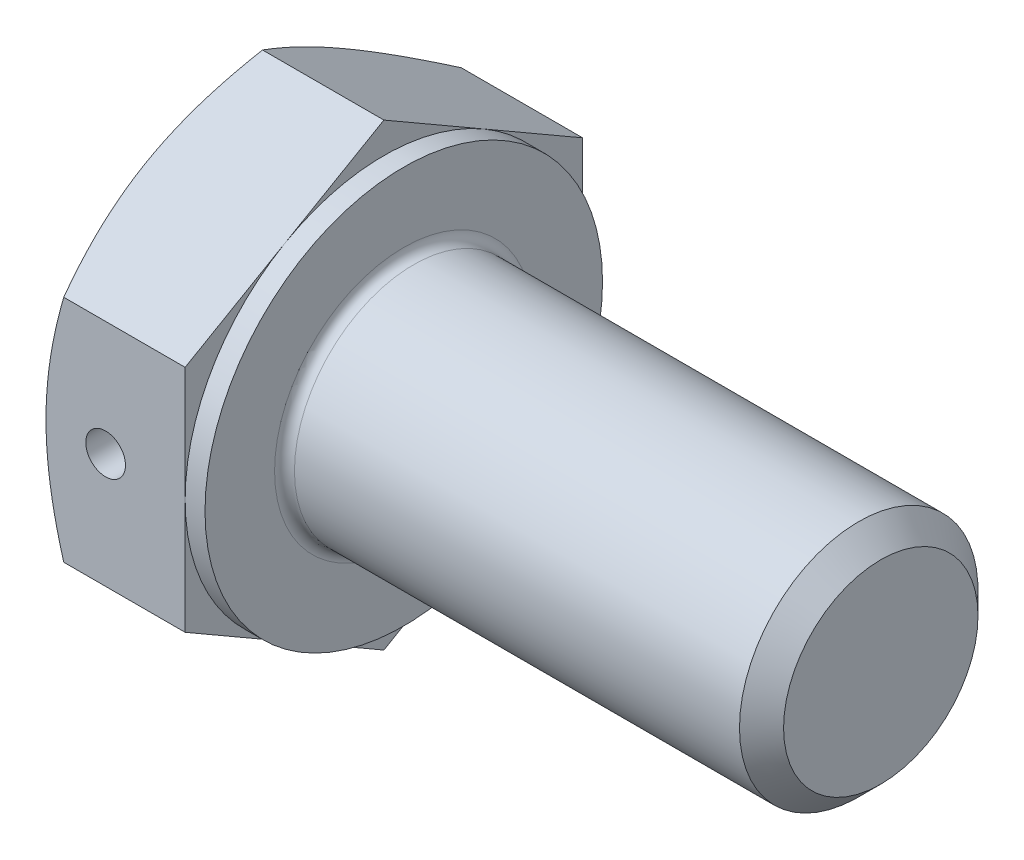
ISO-10303-21;
HEADER;
FILE_DESCRIPTION(('STEP AP214'),'2;1');
FILE_NAME('part.step','',(''),(''),'','','');
FILE_SCHEMA(('AUTOMOTIVE_DESIGN { 1 0 10303 214 1 1 1 1 }'));
ENDSEC;
DATA;
#1=APPLICATION_CONTEXT('core data for automotive mechanical design processes');
#2=APPLICATION_PROTOCOL_DEFINITION('international standard','automotive_design',2000,#1);
#3=PRODUCT_CONTEXT('',#1,'mechanical');
#4=PRODUCT('Part','Part','',(#3));
#5=PRODUCT_RELATED_PRODUCT_CATEGORY('part','',(#4));
#6=PRODUCT_DEFINITION_FORMATION('','',#4);
#7=PRODUCT_DEFINITION_CONTEXT('part definition',#1,'design');
#8=PRODUCT_DEFINITION('design','',#6,#7);
#9=PRODUCT_DEFINITION_SHAPE('','',#8);
#10=(LENGTH_UNIT() NAMED_UNIT(*) SI_UNIT(.MILLI.,.METRE.));
#11=(NAMED_UNIT(*) PLANE_ANGLE_UNIT() SI_UNIT($,.RADIAN.));
#12=(NAMED_UNIT(*) SI_UNIT($,.STERADIAN.) SOLID_ANGLE_UNIT());
#13=UNCERTAINTY_MEASURE_WITH_UNIT(LENGTH_MEASURE(1.E-05),#10,'distance_accuracy_value','');
#14=(GEOMETRIC_REPRESENTATION_CONTEXT(3) GLOBAL_UNCERTAINTY_ASSIGNED_CONTEXT((#13)) GLOBAL_UNIT_ASSIGNED_CONTEXT((#10,
#11,#12)) REPRESENTATION_CONTEXT('',''));
#15=CARTESIAN_POINT('',(0.,0.,0.));
#16=DIRECTION('',(0.,0.,1.));
#17=DIRECTION('',(1.,0.,0.));
#18=AXIS2_PLACEMENT_3D('',#15,#16,#17);
#19=CARTESIAN_POINT('',(4.,5.77350269189626,0.));
#20=DIRECTION('',(1.,0.,0.));
#21=DIRECTION('',(0.,0.,-1.));
#22=AXIS2_PLACEMENT_3D('',#19,#20,#21);
#23=PLANE('',#22);
#24=CARTESIAN_POINT('',(4.,0.,0.));
#25=DIRECTION('',(1.,0.,0.));
#26=DIRECTION('',(0.,0.,-1.));
#27=AXIS2_PLACEMENT_3D('',#24,#25,#26);
#28=CIRCLE('',#27,3.25);
#29=CARTESIAN_POINT('',(4.,0.,-3.25));
#30=VERTEX_POINT('',#29);
#31=EDGE_CURVE('E43',#30,#30,#28,.F.);
#32=ORIENTED_EDGE('',*,*,#31,.T.);
#33=EDGE_LOOP('',(#32));
#34=FACE_BOUND('',#33,.T.);
#35=CARTESIAN_POINT('',(4.,0.,0.));
#36=DIRECTION('',(1.,0.,0.));
#37=DIRECTION('',(0.,0.,-1.));
#38=AXIS2_PLACEMENT_3D('',#35,#36,#37);
#39=CIRCLE('',#38,5.);
#40=CARTESIAN_POINT('',(4.,0.,-5.));
#41=VERTEX_POINT('',#40);
#42=EDGE_CURVE('E302',#41,#41,#39,.T.);
#43=ORIENTED_EDGE('',*,*,#42,.T.);
#44=EDGE_LOOP('',(#43));
#45=FACE_BOUND('',#44,.T.);
#46=ADVANCED_FACE('F35',(#34,#45),#23,.T.);
#47=CARTESIAN_POINT('',(0.,0.,0.));
#48=DIRECTION('',(-1.,0.,0.));
#49=DIRECTION('',(0.,0.,1.));
#50=AXIS2_PLACEMENT_3D('',#47,#48,#49);
#51=CYLINDRICAL_SURFACE('',#50,3.);
#52=CARTESIAN_POINT('',(4.25,0.,0.));
#53=DIRECTION('',(1.,0.,0.));
#54=DIRECTION('',(0.,0.,-1.));
#55=AXIS2_PLACEMENT_3D('',#52,#53,#54);
#56=CIRCLE('',#55,3.);
#57=CARTESIAN_POINT('',(4.25,0.,-3.));
#58=VERTEX_POINT('',#57);
#59=EDGE_CURVE('E11',#58,#58,#56,.T.);
#60=ORIENTED_EDGE('',*,*,#59,.T.);
#61=EDGE_LOOP('',(#60));
#62=FACE_BOUND('',#61,.T.);
#63=CARTESIAN_POINT('',(15.4455,0.,0.));
#64=DIRECTION('',(-1.,0.,0.));
#65=DIRECTION('',(0.,0.,1.));
#66=AXIS2_PLACEMENT_3D('',#63,#64,#65);
#67=CIRCLE('',#66,3.);
#68=CARTESIAN_POINT('',(15.4455,0.,3.));
#69=VERTEX_POINT('',#68);
#70=EDGE_CURVE('E281',#69,#69,#67,.T.);
#71=ORIENTED_EDGE('',*,*,#70,.T.);
#72=EDGE_LOOP('',(#71));
#73=FACE_BOUND('',#72,.T.);
#74=ADVANCED_FACE('F255',(#62,#73),#51,.T.);
#75=CARTESIAN_POINT('',(16.,0.,0.));
#76=DIRECTION('',(-1.,0.,0.));
#77=DIRECTION('',(0.,0.,1.));
#78=AXIS2_PLACEMENT_3D('',#75,#76,#77);
#79=CONICAL_SURFACE('',#78,2.4455,0.785398163397438);
#80=ORIENTED_EDGE('',*,*,#70,.F.);
#81=EDGE_LOOP('',(#80));
#82=FACE_BOUND('',#81,.T.);
#83=CARTESIAN_POINT('',(16.,0.,0.));
#84=DIRECTION('',(-1.,0.,0.));
#85=DIRECTION('',(0.,0.,1.));
#86=AXIS2_PLACEMENT_3D('',#83,#84,#85);
#87=CIRCLE('',#86,2.4455);
#88=CARTESIAN_POINT('',(16.,0.,2.4455));
#89=VERTEX_POINT('',#88);
#90=EDGE_CURVE('E279',#89,#89,#87,.T.);
#91=ORIENTED_EDGE('',*,*,#90,.T.);
#92=EDGE_LOOP('',(#91));
#93=FACE_BOUND('',#92,.T.);
#94=ADVANCED_FACE('F260',(#82,#93),#79,.T.);
#95=CARTESIAN_POINT('',(16.,0.,0.));
#96=DIRECTION('',(-1.,0.,0.));
#97=DIRECTION('',(0.,0.,1.));
#98=AXIS2_PLACEMENT_3D('',#95,#96,#97);
#99=PLANE('',#98);
#100=ORIENTED_EDGE('',*,*,#90,.F.);
#101=EDGE_LOOP('',(#100));
#102=FACE_BOUND('',#101,.T.);
#103=ADVANCED_FACE('F267',(#102),#99,.F.);
#104=CARTESIAN_POINT('',(3.5,5.,0.));
#105=DIRECTION('',(1.,0.,0.));
#106=DIRECTION('',(0.,0.,-1.));
#107=AXIS2_PLACEMENT_3D('',#104,#105,#106);
#108=PLANE('',#107);
#109=DIRECTION('',(0.,0.500000000000001,0.866025403784438));
#110=VECTOR('',#109,1.);
#111=CARTESIAN_POINT('',(3.5,2.88675134594812,-5.));
#112=LINE('',#111,#110);
#113=CARTESIAN_POINT('',(3.5,2.88675134594812,-5.));
#114=VERTEX_POINT('',#113);
#115=CARTESIAN_POINT('',(3.5,4.33012701892219,-2.50000000000001));
#116=VERTEX_POINT('',#115);
#117=EDGE_CURVE('E168',#114,#116,#112,.T.);
#118=ORIENTED_EDGE('',*,*,#117,.T.);
#119=CARTESIAN_POINT('',(3.5,0.,0.));
#120=DIRECTION('',(-1.,0.,0.));
#121=DIRECTION('',(0.,0.,1.));
#122=AXIS2_PLACEMENT_3D('',#119,#120,#121);
#123=CIRCLE('',#122,5.);
#124=CARTESIAN_POINT('',(3.5,0.,-5.));
#125=VERTEX_POINT('',#124);
#126=EDGE_CURVE('E50',#116,#125,#123,.T.);
#127=ORIENTED_EDGE('',*,*,#126,.T.);
#128=DIRECTION('',(0.,1.,0.));
#129=VECTOR('',#128,1.);
#130=CARTESIAN_POINT('',(3.5,2.88675134594812,-5.));
#131=LINE('',#130,#129);
#132=EDGE_CURVE('E305',#125,#114,#131,.T.);
#133=ORIENTED_EDGE('',*,*,#132,.T.);
#134=EDGE_LOOP('',(#118,#127,#133));
#135=FACE_BOUND('',#134,.T.);
#136=ADVANCED_FACE('F270',(#135),#108,.T.);
#137=CARTESIAN_POINT('',(3.5,5.77350269189626,0.));
#138=VERTEX_POINT('',#137);
#139=EDGE_CURVE('E166',#116,#138,#112,.T.);
#140=ORIENTED_EDGE('',*,*,#139,.T.);
#141=DIRECTION('',(0.,-0.500000000000001,0.866025403784438));
#142=VECTOR('',#141,1.);
#143=CARTESIAN_POINT('',(3.5,5.77350269189626,0.));
#144=LINE('',#143,#142);
#145=CARTESIAN_POINT('',(3.5,4.33012701892219,2.5));
#146=VERTEX_POINT('',#145);
#147=EDGE_CURVE('E165',#138,#146,#144,.T.);
#148=ORIENTED_EDGE('',*,*,#147,.T.);
#149=EDGE_CURVE('E154',#146,#116,#123,.T.);
#150=ORIENTED_EDGE('',*,*,#149,.T.);
#151=EDGE_LOOP('',(#140,#148,#150));
#152=FACE_BOUND('',#151,.T.);
#153=ADVANCED_FACE('F275',(#152),#108,.T.);
#154=CARTESIAN_POINT('',(3.5,2.88675134594813,5.));
#155=VERTEX_POINT('',#154);
#156=EDGE_CURVE('E132',#146,#155,#144,.T.);
#157=ORIENTED_EDGE('',*,*,#156,.T.);
#158=DIRECTION('',(0.,-1.,0.));
#159=VECTOR('',#158,1.);
#160=CARTESIAN_POINT('',(3.5,2.88675134594813,5.));
#161=LINE('',#160,#159);
#162=CARTESIAN_POINT('',(3.5,0.,5.));
#163=VERTEX_POINT('',#162);
#164=EDGE_CURVE('E126',#155,#163,#161,.T.);
#165=ORIENTED_EDGE('',*,*,#164,.T.);
#166=EDGE_CURVE('E130',#163,#146,#123,.T.);
#167=ORIENTED_EDGE('',*,*,#166,.T.);
#168=EDGE_LOOP('',(#157,#165,#167));
#169=FACE_BOUND('',#168,.T.);
#170=ADVANCED_FACE('F128',(#169),#108,.T.);
#171=CARTESIAN_POINT('',(3.5,-2.88675134594812,5.));
#172=VERTEX_POINT('',#171);
#173=EDGE_CURVE('E136',#163,#172,#161,.T.);
#174=ORIENTED_EDGE('',*,*,#173,.T.);
#175=DIRECTION('',(0.,-0.500000000000002,-0.866025403784437));
#176=VECTOR('',#175,1.);
#177=CARTESIAN_POINT('',(3.5,-5.77350269189626,0.));
#178=LINE('',#177,#176);
#179=CARTESIAN_POINT('',(3.5,-4.33012701892219,2.50000000000001));
#180=VERTEX_POINT('',#179);
#181=EDGE_CURVE('E143',#172,#180,#178,.T.);
#182=ORIENTED_EDGE('',*,*,#181,.T.);
#183=EDGE_CURVE('E140',#180,#163,#123,.T.);
#184=ORIENTED_EDGE('',*,*,#183,.T.);
#185=EDGE_LOOP('',(#174,#182,#184));
#186=FACE_BOUND('',#185,.T.);
#187=ADVANCED_FACE('F141',(#186),#108,.T.);
#188=CARTESIAN_POINT('',(3.5,-5.77350269189626,0.));
#189=VERTEX_POINT('',#188);
#190=EDGE_CURVE('E160',#180,#189,#178,.T.);
#191=ORIENTED_EDGE('',*,*,#190,.T.);
#192=DIRECTION('',(0.,0.5,-0.866025403784439));
#193=VECTOR('',#192,1.);
#194=CARTESIAN_POINT('',(3.5,-2.88675134594814,-5.));
#195=LINE('',#194,#193);
#196=CARTESIAN_POINT('',(3.5,-4.33012701892219,-2.5));
#197=VERTEX_POINT('',#196);
#198=EDGE_CURVE('E344',#189,#197,#195,.T.);
#199=ORIENTED_EDGE('',*,*,#198,.T.);
#200=EDGE_CURVE('E147',#197,#180,#123,.T.);
#201=ORIENTED_EDGE('',*,*,#200,.T.);
#202=EDGE_LOOP('',(#191,#199,#201));
#203=FACE_BOUND('',#202,.T.);
#204=ADVANCED_FACE('F424',(#203),#108,.T.);
#205=CARTESIAN_POINT('',(3.5,-2.88675134594814,-5.));
#206=VERTEX_POINT('',#205);
#207=EDGE_CURVE('E155',#197,#206,#195,.T.);
#208=ORIENTED_EDGE('',*,*,#207,.T.);
#209=EDGE_CURVE('E306',#206,#125,#131,.T.);
#210=ORIENTED_EDGE('',*,*,#209,.T.);
#211=EDGE_CURVE('E313',#125,#197,#123,.T.);
#212=ORIENTED_EDGE('',*,*,#211,.T.);
#213=EDGE_LOOP('',(#208,#210,#212));
#214=FACE_BOUND('',#213,.T.);
#215=ADVANCED_FACE('F276',(#214),#108,.T.);
#216=CARTESIAN_POINT('',(0.,0.,0.));
#217=DIRECTION('',(-1.,0.,0.));
#218=DIRECTION('',(0.,0.,1.));
#219=AXIS2_PLACEMENT_3D('',#216,#217,#218);
#220=CYLINDRICAL_SURFACE('',#219,5.);
#221=ORIENTED_EDGE('',*,*,#126,.F.);
#222=ORIENTED_EDGE('',*,*,#149,.F.);
#223=ORIENTED_EDGE('',*,*,#166,.F.);
#224=ORIENTED_EDGE('',*,*,#183,.F.);
#225=ORIENTED_EDGE('',*,*,#200,.F.);
#226=ORIENTED_EDGE('',*,*,#211,.F.);
#227=EDGE_LOOP('',(#221,#222,#223,#224,#225,#226));
#228=FACE_BOUND('',#227,.T.);
#229=ORIENTED_EDGE('',*,*,#42,.F.);
#230=EDGE_LOOP('',(#229));
#231=FACE_BOUND('',#230,.T.);
#232=ADVANCED_FACE('F151',(#228,#231),#220,.T.);
#233=CARTESIAN_POINT('',(0.,5.77350269189626,0.));
#234=DIRECTION('',(1.,0.,0.));
#235=DIRECTION('',(0.,0.,-1.));
#236=AXIS2_PLACEMENT_3D('',#233,#234,#235);
#237=PLANE('',#236);
#238=CARTESIAN_POINT('',(0.,0.,0.));
#239=DIRECTION('',(1.,0.,0.));
#240=DIRECTION('',(0.,0.,-1.));
#241=AXIS2_PLACEMENT_3D('',#238,#239,#240);
#242=CIRCLE('',#241,5.);
#243=CARTESIAN_POINT('',(0.,0.,-5.));
#244=VERTEX_POINT('',#243);
#245=CARTESIAN_POINT('',(0.,4.33012701892219,-2.50000000000001));
#246=VERTEX_POINT('',#245);
#247=EDGE_CURVE('E301',#244,#246,#242,.T.);
#248=ORIENTED_EDGE('',*,*,#247,.F.);
#249=CARTESIAN_POINT('',(0.,-4.33012701892219,-2.5));
#250=VERTEX_POINT('',#249);
#251=EDGE_CURVE('E297',#250,#244,#242,.T.);
#252=ORIENTED_EDGE('',*,*,#251,.F.);
#253=CARTESIAN_POINT('',(0.,-4.33012701892219,2.50000000000001));
#254=VERTEX_POINT('',#253);
#255=EDGE_CURVE('E300',#254,#250,#242,.T.);
#256=ORIENTED_EDGE('',*,*,#255,.F.);
#257=CARTESIAN_POINT('',(0.,0.,5.));
#258=VERTEX_POINT('',#257);
#259=EDGE_CURVE('E337',#258,#254,#242,.T.);
#260=ORIENTED_EDGE('',*,*,#259,.F.);
#261=CARTESIAN_POINT('',(0.,0.,0.));
#262=DIRECTION('',(-1.,0.,0.));
#263=DIRECTION('',(0.,0.,1.));
#264=AXIS2_PLACEMENT_3D('',#261,#262,#263);
#265=CIRCLE('',#264,5.);
#266=CARTESIAN_POINT('',(0.,4.33012701892219,2.5));
#267=VERTEX_POINT('',#266);
#268=EDGE_CURVE('E169',#258,#267,#265,.T.);
#269=ORIENTED_EDGE('',*,*,#268,.T.);
#270=EDGE_CURVE('E537',#246,#267,#242,.T.);
#271=ORIENTED_EDGE('',*,*,#270,.F.);
#272=EDGE_LOOP('',(#248,#252,#256,#260,#269,#271));
#273=FACE_BOUND('',#272,.T.);
#274=ADVANCED_FACE('F200',(#273),#237,.F.);
#275=CARTESIAN_POINT('',(0.,0.,0.));
#276=DIRECTION('',(1.,0.,0.));
#277=DIRECTION('',(0.,0.,-1.));
#278=AXIS2_PLACEMENT_3D('',#275,#276,#277);
#279=CONICAL_SURFACE('',#278,5.,1.0471975511966);
#280=CARTESIAN_POINT('',(0.446648656051828,2.88663587589429,5.0002));
#281=CARTESIAN_POINT('',(0.373386567637634,3.01349970319368,4.78046540547481));
#282=CARTESIAN_POINT('',(0.306751321918091,3.14144859993849,4.55885141554042));
#283=CARTESIAN_POINT('',(0.190438991010811,3.39956193532121,4.11178600454649));
#284=CARTESIAN_POINT('',(0.140803049915789,3.52973095989718,3.88632664040923));
#285=CARTESIAN_POINT('',(0.0635510254186983,3.78847564779797,3.43816769477649));
#286=CARTESIAN_POINT('',(0.0354203782834895,3.91701101576052,3.21553790689581));
#287=CARTESIAN_POINT('',(0.0101949219536847,4.11026620624322,2.88081009815336));
#288=CARTESIAN_POINT('',(0.0046134597694843,4.17472868879311,2.76915780319494));
#289=CARTESIAN_POINT('',(-0.000797783248529215,4.30371322717528,2.5457500293262));
#290=CARTESIAN_POINT('',(-0.000627741741795892,4.36823528110589,2.43399455370969));
#291=CARTESIAN_POINT('',(0.00775363179203763,4.54500768479194,2.12781576914936));
#292=CARTESIAN_POINT('',(0.0218297718972528,4.65719946015293,1.93349391403279));
#293=CARTESIAN_POINT('',(0.0664652571094323,4.88083840557981,1.54613989800229));
#294=CARTESIAN_POINT('',(0.0970398601475096,4.9922847895602,1.35310909862843));
#295=CARTESIAN_POINT('',(0.173468493621165,5.21637431361295,0.964974657525145));
#296=CARTESIAN_POINT('',(0.219646378878682,5.32898917185759,0.769920001358264));
#297=CARTESIAN_POINT('',(0.324451794491936,5.55253939626498,0.382719654641232));
#298=CARTESIAN_POINT('',(0.383054703437376,5.66347762579592,0.190569004591914));
#299=CARTESIAN_POINT('',(0.446648656051831,5.7736181619501,-0.000200000000000145));
#300=B_SPLINE_CURVE_WITH_KNOTS('',3,(#280,#281,#282,#283,#284,#285,#286,#287,#288,#289,#290,
#291,#292,#293,#294,#295,#296,#297,#298,#299),.UNSPECIFIED.,.F.,.F.,(4,2,2,2,2,2,2,2,2,4),(0.,
0.792555841363092,1.58701660053333,2.3618153748728,2.74884076077325,3.13585419177295,
3.80962362599679,4.48401723901189,5.17336882348929,5.86136694793726),.UNSPECIFIED.);
#301=CARTESIAN_POINT('',(0.446581987385204,5.77350269189626,0.));
#302=VERTEX_POINT('',#301);
#303=EDGE_CURVE('E220',#267,#302,#300,.T.);
#304=ORIENTED_EDGE('',*,*,#303,.T.);
#305=CARTESIAN_POINT('',(0.446648656051831,5.7736181619501,0.0002));
#306=CARTESIAN_POINT('',(0.373386567637636,5.64675433465071,-0.219534594525184));
#307=CARTESIAN_POINT('',(0.306751321918093,5.5188054379059,-0.44114858445958));
#308=CARTESIAN_POINT('',(0.190438991010812,5.26069210252318,-0.888213995453513));
#309=CARTESIAN_POINT('',(0.14080304991579,5.13052307794721,-1.11367335959077));
#310=CARTESIAN_POINT('',(0.0635510254186986,4.87177839004641,-1.56183230522351));
#311=CARTESIAN_POINT('',(0.0354203782834896,4.74324302208387,-1.78446209310419));
#312=CARTESIAN_POINT('',(0.0101949219536845,4.54998783160116,-2.11918990184664));
#313=CARTESIAN_POINT('',(0.004613459769484,4.48552534905128,-2.23084219680506));
#314=CARTESIAN_POINT('',(-0.000797783248529931,4.35654081066911,-2.4542499706738));
#315=CARTESIAN_POINT('',(-0.000627741741796942,4.2920187567385,-2.56600544629031));
#316=CARTESIAN_POINT('',(0.00775363179203599,4.11524635305244,-2.87218423085064));
#317=CARTESIAN_POINT('',(0.0218297718972511,4.00305457769146,-3.06650608596721));
#318=CARTESIAN_POINT('',(0.0664652571094302,3.77941563226457,-3.4538601019977));
#319=CARTESIAN_POINT('',(0.0970398601475071,3.66796924828418,-3.64689090137157));
#320=CARTESIAN_POINT('',(0.173468493621162,3.44387972423144,-4.03502534247485));
#321=CARTESIAN_POINT('',(0.219646378878678,3.3312648659868,-4.23007999864173));
#322=CARTESIAN_POINT('',(0.324451794491932,3.1077146415794,-4.61728034535877));
#323=CARTESIAN_POINT('',(0.383054703437373,2.99677641204846,-4.80943099540808));
#324=CARTESIAN_POINT('',(0.446648656051827,2.88663587589428,-5.0002));
#325=B_SPLINE_CURVE_WITH_KNOTS('',3,(#305,#306,#307,#308,#309,#310,#311,#312,#313,#314,#315,
#316,#317,#318,#319,#320,#321,#322,#323,#324),.UNSPECIFIED.,.F.,.F.,(4,2,2,2,2,2,2,2,2,4),(0.,
0.792555841363091,1.58701660053333,2.36181537487281,2.74884076077325,3.13585419177295,
3.80962362599679,4.48401723901189,5.17336882348929,5.86136694793726),.UNSPECIFIED.);
#326=EDGE_CURVE('E58',#302,#246,#325,.T.);
#327=ORIENTED_EDGE('',*,*,#326,.T.);
#328=ORIENTED_EDGE('',*,*,#270,.T.);
#329=EDGE_LOOP('',(#304,#327,#328));
#330=FACE_BOUND('',#329,.T.);
#331=ADVANCED_FACE('F464',(#330),#279,.T.);
#332=CARTESIAN_POINT('',(2.47533544689295,-7.82661640313889,5.));
#333=CARTESIAN_POINT('',(2.36879683507773,-7.60758613024921,5.));
#334=CARTESIAN_POINT('',(2.26325911833056,-7.3880607136441,5.));
#335=CARTESIAN_POINT('',(2.0547470786595,-6.94775649535433,5.));
#336=CARTESIAN_POINT('',(1.95177314617002,-6.72697750897688,5.));
#337=CARTESIAN_POINT('',(1.74844778545275,-6.28280027125597,5.));
#338=CARTESIAN_POINT('',(1.64811306490869,-6.05939434592713,5.));
#339=CARTESIAN_POINT('',(1.45145486004312,-5.6108304383292,5.));
#340=CARTESIAN_POINT('',(1.35513119080617,-5.38567253739804,5.));
#341=CARTESIAN_POINT('',(1.1644503760596,-4.92576614780202,5.));
#342=CARTESIAN_POINT('',(1.07026351405995,-4.69094667859484,5.));
#343=CARTESIAN_POINT('',(0.888844387350836,-4.21858752735362,5.));
#344=CARTESIAN_POINT('',(0.801612892640658,-3.98104754746317,5.));
#345=CARTESIAN_POINT('',(0.636341071883238,-3.50329086404363,5.));
#346=CARTESIAN_POINT('',(0.558282765149709,-3.26308044250486,5.));
#347=CARTESIAN_POINT('',(0.413813856737664,-2.77921467819531,5.));
#348=CARTESIAN_POINT('',(0.347399663631974,-2.53556042275999,5.));
#349=CARTESIAN_POINT('',(0.22970745053505,-2.04600448312503,5.));
#350=CARTESIAN_POINT('',(0.178346573442478,-1.80012308686183,5.));
#351=CARTESIAN_POINT('',(0.0936230804935147,-1.30522837494365,5.));
#352=CARTESIAN_POINT('',(0.0602585789244923,-1.05621539022477,5.));
#353=CARTESIAN_POINT('',(0.0146229933804845,-0.559584253783065,5.));
#354=CARTESIAN_POINT('',(0.00207498506584089,-0.311992192967672,5.));
#355=CARTESIAN_POINT('',(-0.00159747165030503,0.18337558405674,5.));
#356=CARTESIAN_POINT('',(0.00727849448086304,0.431151303726643,5.));
#357=CARTESIAN_POINT('',(0.0397265053205849,0.84962286075823,5.));
#358=CARTESIAN_POINT('',(0.0579847912618801,1.02075746544157,5.));
#359=CARTESIAN_POINT('',(0.103624049996723,1.3618139875752,5.));
#360=CARTESIAN_POINT('',(0.131006199082925,1.53173574577271,5.));
#361=CARTESIAN_POINT('',(0.225403333816324,2.03942834541587,5.));
#362=CARTESIAN_POINT('',(0.304653621104038,2.37495177168563,5.));
#363=CARTESIAN_POINT('',(0.442611792168641,2.87686006020152,5.));
#364=CARTESIAN_POINT('',(0.492453035928118,3.04583048582565,5.));
#365=CARTESIAN_POINT('',(0.597441969480142,3.38213061038659,5.));
#366=CARTESIAN_POINT('',(0.652589698776808,3.5494602970987,5.));
#367=CARTESIAN_POINT('',(0.767295730006399,3.88253122341817,5.));
#368=CARTESIAN_POINT('',(0.826852713137817,4.04827292137365,5.));
#369=CARTESIAN_POINT('',(0.949663499110053,4.37837269604184,5.));
#370=CARTESIAN_POINT('',(1.01291722636637,4.54273080096526,5.));
#371=CARTESIAN_POINT('',(1.18384085306905,4.9746759403977,5.));
#372=CARTESIAN_POINT('',(1.29410564783453,5.24123504256649,5.));
#373=CARTESIAN_POINT('',(1.52085041203993,5.77170603526335,5.));
#374=CARTESIAN_POINT('',(1.63733099805397,6.03561766007929,5.));
#375=CARTESIAN_POINT('',(1.87507624393349,6.56138078778338,5.));
#376=CARTESIAN_POINT('',(1.99634255328238,6.82323154239329,5.));
#377=CARTESIAN_POINT('',(2.24254703861693,7.34518395602016,5.));
#378=CARTESIAN_POINT('',(2.36748508200602,7.60528567778375,5.));
#379=CARTESIAN_POINT('',(2.62044102887898,8.12446478659922,5.));
#380=CARTESIAN_POINT('',(2.74846325062126,8.38354006552433,5.));
#381=CARTESIAN_POINT('',(3.00682668967549,8.90053291127541,5.));
#382=CARTESIAN_POINT('',(3.13716793074432,9.15845046620729,5.));
#383=CARTESIAN_POINT('',(3.53092424591317,9.93067662274979,5.));
#384=CARTESIAN_POINT('',(3.79712405172275,10.4435647238032,5.));
#385=CARTESIAN_POINT('',(4.30724046881171,11.4147548711532,5.));
#386=CARTESIAN_POINT('',(4.55067498762245,11.873311348306,5.));
#387=CARTESIAN_POINT('',(5.04052915785298,12.7888590468283,5.));
#388=CARTESIAN_POINT('',(5.28694897482744,13.2458501795696,5.));
#389=CARTESIAN_POINT('',(5.7812250534644,14.1571829390174,5.));
#390=CARTESIAN_POINT('',(6.02907430461245,14.6115283739736,5.));
#391=CARTESIAN_POINT('',(6.5264818551985,15.5192398746589,5.));
#392=CARTESIAN_POINT('',(6.77604002809907,15.9726060096992,5.));
#393=CARTESIAN_POINT('',(7.02622264559118,16.4256251044156,5.));
#394=B_SPLINE_CURVE_WITH_KNOTS('',3,(#332,#333,#334,#335,#336,#337,#338,#339,#340,#341,#342,
#343,#344,#345,#346,#347,#348,#349,#350,#351,#352,#353,#354,#355,#356,#357,#358,#359,#360,#361,
#362,#363,#364,#365,#366,#367,#368,#369,#370,#371,#372,#373,#374,#375,#376,#377,#378,#379,#380,
#381,#382,#383,#384,#385,#386,#387,#388,#389,#390,#391,#392,#393),.UNSPECIFIED.,.F.,.F.,(4,2,2,
2,2,2,2,2,2,2,2,2,2,2,2,2,2,2,2,2,2,2,2,2,2,2,2,2,2,2,4),(0.,0.730708682143098,1.4615279703375,
2.19620403652928,2.930846195478,3.68977491658213,4.44878753915767,5.20628666210828,
5.9635517348485,6.71656679485872,7.46950293642267,8.21233991237299,8.95519126159773,
9.47125991232469,9.98739512288342,11.0201893937443,11.5486465414698,12.0771076235976,
12.6054112774226,13.1337041332035,13.9989833719716,14.8643486020619,15.7300147459346,
16.5956496665091,17.4625765068272,18.3295122333794,20.0630293163822,21.6205191219182,
23.1780956996636,24.7307447704824,26.2832800921359),.UNSPECIFIED.);
#395=CARTESIAN_POINT('',(0.446581987385202,2.88675134594813,5.));
#396=VERTEX_POINT('',#395);
#397=EDGE_CURVE('E234',#258,#396,#394,.T.);
#398=ORIENTED_EDGE('',*,*,#397,.T.);
#399=EDGE_CURVE('E233',#396,#267,#300,.T.);
#400=ORIENTED_EDGE('',*,*,#399,.T.);
#401=ORIENTED_EDGE('',*,*,#268,.F.);
#402=EDGE_LOOP('',(#398,#400,#401));
#403=FACE_BOUND('',#402,.T.);
#404=ADVANCED_FACE('F331',(#403),#279,.T.);
#405=CARTESIAN_POINT('',(0.4465819873852,-2.88675134594812,5.));
#406=VERTEX_POINT('',#405);
#407=EDGE_CURVE('E282',#406,#258,#394,.T.);
#408=ORIENTED_EDGE('',*,*,#407,.T.);
#409=ORIENTED_EDGE('',*,*,#259,.T.);
#410=CARTESIAN_POINT('',(0.446648656051832,-5.7736181619501,-0.000200000000000053));
#411=CARTESIAN_POINT('',(0.373386567637638,-5.64675433465071,0.219534594525185));
#412=CARTESIAN_POINT('',(0.306751321918095,-5.5188054379059,0.441148584459581));
#413=CARTESIAN_POINT('',(0.190438991010813,-5.26069210252318,0.888213995453513));
#414=CARTESIAN_POINT('',(0.140803049915791,-5.13052307794721,1.11367335959077));
#415=CARTESIAN_POINT('',(0.0635510254186995,-4.87177839004641,1.56183230522351));
#416=CARTESIAN_POINT('',(0.0354203782834905,-4.74324302208387,1.78446209310419));
#417=CARTESIAN_POINT('',(0.0101949219536848,-4.54998783160116,2.11918990184664));
#418=CARTESIAN_POINT('',(0.00461345976948395,-4.48552534905128,2.23084219680506));
#419=CARTESIAN_POINT('',(-0.000797783248529864,-4.35654081066911,2.4542499706738));
#420=CARTESIAN_POINT('',(-0.000627741741796435,-4.2920187567385,2.56600544629031));
#421=CARTESIAN_POINT('',(0.00775363179203685,-4.11524635305244,2.87218423085064));
#422=CARTESIAN_POINT('',(0.0218297718972513,-4.00305457769146,3.06650608596721));
#423=CARTESIAN_POINT('',(0.0664652571094299,-3.77941563226457,3.4538601019977));
#424=CARTESIAN_POINT('',(0.097039860147507,-3.66796924828418,3.64689090137157));
#425=CARTESIAN_POINT('',(0.173468493621162,-3.44387972423143,4.03502534247485));
#426=CARTESIAN_POINT('',(0.219646378878678,-3.33126486598679,4.23007999864174));
#427=CARTESIAN_POINT('',(0.324451794491932,-3.1077146415794,4.61728034535877));
#428=CARTESIAN_POINT('',(0.383054703437372,-2.99677641204846,4.80943099540809));
#429=CARTESIAN_POINT('',(0.446648656051826,-2.88663587589428,5.0002));
#430=B_SPLINE_CURVE_WITH_KNOTS('',3,(#410,#411,#412,#413,#414,#415,#416,#417,#418,#419,#420,
#421,#422,#423,#424,#425,#426,#427,#428,#429),.UNSPECIFIED.,.F.,.F.,(4,2,2,2,2,2,2,2,2,4),(0.,
0.792555841363092,1.58701660053334,2.36181537487281,2.74884076077326,3.13585419177295,
3.8096236259968,4.4840172390119,5.17336882348929,5.86136694793726),.UNSPECIFIED.);
#431=EDGE_CURVE('E222',#254,#406,#430,.T.);
#432=ORIENTED_EDGE('',*,*,#431,.T.);
#433=EDGE_LOOP('',(#408,#409,#432));
#434=FACE_BOUND('',#433,.T.);
#435=ADVANCED_FACE('F189',(#434),#279,.T.);
#436=CARTESIAN_POINT('',(0.446581987385206,-5.77350269189626,0.));
#437=VERTEX_POINT('',#436);
#438=EDGE_CURVE('E214',#437,#254,#430,.T.);
#439=ORIENTED_EDGE('',*,*,#438,.T.);
#440=ORIENTED_EDGE('',*,*,#255,.T.);
#441=CARTESIAN_POINT('',(0.446648656051831,-2.8866358758943,-5.0002));
#442=CARTESIAN_POINT('',(0.373386567637637,-3.01349970319369,-4.78046540547481));
#443=CARTESIAN_POINT('',(0.306751321918094,-3.1414485999385,-4.55885141554042));
#444=CARTESIAN_POINT('',(0.190438991010813,-3.39956193532121,-4.11178600454649));
#445=CARTESIAN_POINT('',(0.140803049915792,-3.52973095989718,-3.88632664040922));
#446=CARTESIAN_POINT('',(0.0635510254187008,-3.78847564779798,-3.43816769477649));
#447=CARTESIAN_POINT('',(0.0354203782834923,-3.91701101576052,-3.2155379068958));
#448=CARTESIAN_POINT('',(0.010194921953688,-4.11026620624323,-2.88081009815336));
#449=CARTESIAN_POINT('',(0.00461345976948779,-4.17472868879311,-2.76915780319494));
#450=CARTESIAN_POINT('',(-0.000797783248525694,-4.30371322717528,-2.5457500293262));
#451=CARTESIAN_POINT('',(-0.000627741741792554,-4.3682352811059,-2.43399455370968));
#452=CARTESIAN_POINT('',(0.00775363179204073,-4.54500768479195,-2.12781576914936));
#453=CARTESIAN_POINT('',(0.021829771897256,-4.65719946015293,-1.93349391403278));
#454=CARTESIAN_POINT('',(0.0664652571094357,-4.88083840557982,-1.54613989800229));
#455=CARTESIAN_POINT('',(0.097039860147513,-4.99228478956021,-1.35310909862843));
#456=CARTESIAN_POINT('',(0.173468493621168,-5.21637431361296,-0.964974657525144));
#457=CARTESIAN_POINT('',(0.219646378878684,-5.32898917185759,-0.769920001358263));
#458=CARTESIAN_POINT('',(0.324451794491938,-5.55253939626499,-0.382719654641231));
#459=CARTESIAN_POINT('',(0.383054703437377,-5.66347762579592,-0.190569004591914));
#460=CARTESIAN_POINT('',(0.446648656051832,-5.7736181619501,0.000199999999999122));
#461=B_SPLINE_CURVE_WITH_KNOTS('',3,(#441,#442,#443,#444,#445,#446,#447,#448,#449,#450,#451,
#452,#453,#454,#455,#456,#457,#458,#459,#460),.UNSPECIFIED.,.F.,.F.,(4,2,2,2,2,2,2,2,2,4),(0.,
0.792555841363091,1.58701660053334,2.36181537487281,2.74884076077326,3.13585419177295,
3.80962362599679,4.48401723901189,5.17336882348929,5.86136694793725),.UNSPECIFIED.);
#462=EDGE_CURVE('E221',#250,#437,#461,.T.);
#463=ORIENTED_EDGE('',*,*,#462,.T.);
#464=EDGE_LOOP('',(#439,#440,#463));
#465=FACE_BOUND('',#464,.T.);
#466=ADVANCED_FACE('F476',(#465),#279,.T.);
#467=CARTESIAN_POINT('',(0.446581987385201,2.88675134594812,-5.));
#468=VERTEX_POINT('',#467);
#469=EDGE_CURVE('E223',#246,#468,#325,.T.);
#470=ORIENTED_EDGE('',*,*,#469,.T.);
#471=CARTESIAN_POINT('',(2.47533544689296,-7.82661640313891,-5.));
#472=CARTESIAN_POINT('',(2.36879683507774,-7.60758613024923,-5.));
#473=CARTESIAN_POINT('',(2.26325911833057,-7.38806071364412,-5.));
#474=CARTESIAN_POINT('',(2.05474707865951,-6.94775649535435,-5.));
#475=CARTESIAN_POINT('',(1.95177314617003,-6.7269775089769,-5.));
#476=CARTESIAN_POINT('',(1.74844778545275,-6.28280027125599,-5.));
#477=CARTESIAN_POINT('',(1.6481130649087,-6.05939434592714,-5.));
#478=CARTESIAN_POINT('',(1.45145486004313,-5.61083043832922,-5.));
#479=CARTESIAN_POINT('',(1.35513119080618,-5.38567253739806,-5.));
#480=CARTESIAN_POINT('',(1.16445037605961,-4.92576614780204,-5.));
#481=CARTESIAN_POINT('',(1.07026351405996,-4.69094667859486,-5.));
#482=CARTESIAN_POINT('',(0.888844387350842,-4.21858752735364,-5.));
#483=CARTESIAN_POINT('',(0.801612892640664,-3.98104754746318,-5.));
#484=CARTESIAN_POINT('',(0.636341071883244,-3.50329086404365,-5.));
#485=CARTESIAN_POINT('',(0.558282765149714,-3.26308044250488,-5.));
#486=CARTESIAN_POINT('',(0.413813856737668,-2.77921467819533,-5.));
#487=CARTESIAN_POINT('',(0.347399663631978,-2.53556042276,-5.));
#488=CARTESIAN_POINT('',(0.229707450535054,-2.04600448312504,-5.));
#489=CARTESIAN_POINT('',(0.178346573442481,-1.80012308686185,-5.));
#490=CARTESIAN_POINT('',(0.0936230804935175,-1.30522837494366,-5.));
#491=CARTESIAN_POINT('',(0.060258578924494,-1.05621539022479,-5.));
#492=CARTESIAN_POINT('',(0.0146229933804854,-0.559584253783077,-5.));
#493=CARTESIAN_POINT('',(0.00207498506584205,-0.311992192967685,-5.));
#494=CARTESIAN_POINT('',(-0.00159747165030468,0.183375584056729,-5.));
#495=CARTESIAN_POINT('',(0.00727849448086241,0.431151303726632,-5.));
#496=CARTESIAN_POINT('',(0.0397265053205839,0.849622860758219,-5.));
#497=CARTESIAN_POINT('',(0.0579847912618793,1.02075746544156,-5.));
#498=CARTESIAN_POINT('',(0.103624049996722,1.36181398757519,-5.));
#499=CARTESIAN_POINT('',(0.131006199082924,1.5317357457727,-5.));
#500=CARTESIAN_POINT('',(0.225403333816321,2.03942834541586,-5.));
#501=CARTESIAN_POINT('',(0.304653621104035,2.37495177168562,-5.));
#502=CARTESIAN_POINT('',(0.442611792168637,2.87686006020151,-5.));
#503=CARTESIAN_POINT('',(0.492453035928114,3.04583048582564,-5.));
#504=CARTESIAN_POINT('',(0.597441969480138,3.38213061038658,-5.));
#505=CARTESIAN_POINT('',(0.652589698776802,3.54946029709868,-5.));
#506=CARTESIAN_POINT('',(0.767295730006393,3.88253122341816,-5.));
#507=CARTESIAN_POINT('',(0.826852713137811,4.04827292137363,-5.));
#508=CARTESIAN_POINT('',(0.949663499110047,4.37837269604182,-5.));
#509=CARTESIAN_POINT('',(1.01291722636637,4.54273080096525,-5.));
#510=CARTESIAN_POINT('',(1.18384085306905,4.97467594039768,-5.));
#511=CARTESIAN_POINT('',(1.29410564783452,5.24123504256647,-5.));
#512=CARTESIAN_POINT('',(1.52085041203992,5.77170603526333,-5.));
#513=CARTESIAN_POINT('',(1.63733099805396,6.03561766007927,-5.));
#514=CARTESIAN_POINT('',(1.87507624393348,6.56138078778336,-5.));
#515=CARTESIAN_POINT('',(1.99634255328237,6.82323154239328,-5.));
#516=CARTESIAN_POINT('',(2.24254703861692,7.34518395602014,-5.));
#517=CARTESIAN_POINT('',(2.36748508200601,7.60528567778373,-5.));
#518=CARTESIAN_POINT('',(2.62044102887897,8.12446478659921,-5.));
#519=CARTESIAN_POINT('',(2.74846325062125,8.38354006552432,-5.));
#520=CARTESIAN_POINT('',(3.00682668967549,8.90053291127539,-5.));
#521=CARTESIAN_POINT('',(3.13716793074432,9.15845046620728,-5.));
#522=CARTESIAN_POINT('',(3.53092424591316,9.93067662274978,-5.));
#523=CARTESIAN_POINT('',(3.79712405172274,10.4435647238032,-5.));
#524=CARTESIAN_POINT('',(4.3072404688117,11.4147548711532,-5.));
#525=CARTESIAN_POINT('',(4.55067498762245,11.873311348306,-5.));
#526=CARTESIAN_POINT('',(5.04052915785298,12.7888590468283,-5.));
#527=CARTESIAN_POINT('',(5.28694897482743,13.2458501795696,-5.));
#528=CARTESIAN_POINT('',(5.7812250534644,14.1571829390173,-5.));
#529=CARTESIAN_POINT('',(6.02907430461245,14.6115283739736,-5.));
#530=CARTESIAN_POINT('',(6.5264818551985,15.5192398746589,-5.));
#531=CARTESIAN_POINT('',(6.77604002809907,15.9726060096992,-5.));
#532=CARTESIAN_POINT('',(7.02622264559118,16.4256251044156,-5.));
#533=B_SPLINE_CURVE_WITH_KNOTS('',3,(#471,#472,#473,#474,#475,#476,#477,#478,#479,#480,#481,
#482,#483,#484,#485,#486,#487,#488,#489,#490,#491,#492,#493,#494,#495,#496,#497,#498,#499,#500,
#501,#502,#503,#504,#505,#506,#507,#508,#509,#510,#511,#512,#513,#514,#515,#516,#517,#518,#519,
#520,#521,#522,#523,#524,#525,#526,#527,#528,#529,#530,#531,#532),.UNSPECIFIED.,.F.,.F.,(4,2,2,
2,2,2,2,2,2,2,2,2,2,2,2,2,2,2,2,2,2,2,2,2,2,2,2,2,2,2,4),(0.,0.730708682143099,1.46152797033751,
2.19620403652929,2.930846195478,3.68977491658214,4.44878753915768,5.20628666210828,
5.9635517348485,6.71656679485872,7.46950293642268,8.212339912373,8.95519126159775,
9.4712599123247,9.98739512288343,11.0201893937443,11.5486465414698,12.0771076235976,
12.6054112774226,13.1337041332035,13.9989833719716,14.8643486020619,15.7300147459346,
16.5956496665091,17.4625765068272,18.3295122333794,20.0630293163822,21.6205191219182,
23.1780956996636,24.7307447704824,26.2832800921359),.UNSPECIFIED.);
#534=EDGE_CURVE('E181',#468,#244,#533,.F.);
#535=ORIENTED_EDGE('',*,*,#534,.T.);
#536=ORIENTED_EDGE('',*,*,#247,.T.);
#537=EDGE_LOOP('',(#470,#535,#536));
#538=FACE_BOUND('',#537,.T.);
#539=ADVANCED_FACE('F472',(#538),#279,.T.);
#540=CARTESIAN_POINT('',(0.44658198738495,-2.88675134594852,-5.));
#541=VERTEX_POINT('',#540);
#542=EDGE_CURVE('E182',#541,#250,#461,.T.);
#543=ORIENTED_EDGE('',*,*,#542,.T.);
#544=ORIENTED_EDGE('',*,*,#251,.T.);
#545=EDGE_CURVE('E172',#244,#541,#533,.F.);
#546=ORIENTED_EDGE('',*,*,#545,.T.);
#547=EDGE_LOOP('',(#543,#544,#546));
#548=FACE_BOUND('',#547,.T.);
#549=ADVANCED_FACE('F198',(#548),#279,.T.);
#550=CARTESIAN_POINT('',(4.,2.88675134594812,-5.));
#551=DIRECTION('',(0.,0.,1.));
#552=DIRECTION('',(1.,0.,0.));
#553=AXIS2_PLACEMENT_3D('',#550,#551,#552);
#554=PLANE('',#553);
#555=CARTESIAN_POINT('',(1.5,0.,-5.));
#556=DIRECTION('',(0.,0.,1.));
#557=DIRECTION('',(1.,0.,0.));
#558=AXIS2_PLACEMENT_3D('',#555,#556,#557);
#559=CIRCLE('',#558,0.5);
#560=CARTESIAN_POINT('',(2.,0.,-5.));
#561=VERTEX_POINT('',#560);
#562=EDGE_CURVE('E148',#561,#561,#559,.T.);
#563=ORIENTED_EDGE('',*,*,#562,.T.);
#564=EDGE_LOOP('',(#563));
#565=FACE_BOUND('',#564,.T.);
#566=ORIENTED_EDGE('',*,*,#209,.F.);
#567=DIRECTION('',(-1.,0.,0.));
#568=VECTOR('',#567,1.);
#569=CARTESIAN_POINT('',(4.,-2.88675134594814,-5.));
#570=LINE('',#569,#568);
#571=EDGE_CURVE('E288',#206,#541,#570,.T.);
#572=ORIENTED_EDGE('',*,*,#571,.T.);
#573=ORIENTED_EDGE('',*,*,#545,.F.);
#574=ORIENTED_EDGE('',*,*,#534,.F.);
#575=DIRECTION('',(-1.,0.,0.));
#576=VECTOR('',#575,1.);
#577=CARTESIAN_POINT('',(4.,2.88675134594812,-5.));
#578=LINE('',#577,#576);
#579=EDGE_CURVE('E284',#114,#468,#578,.T.);
#580=ORIENTED_EDGE('',*,*,#579,.F.);
#581=ORIENTED_EDGE('',*,*,#132,.F.);
#582=EDGE_LOOP('',(#566,#572,#573,#574,#580,#581));
#583=FACE_BOUND('',#582,.T.);
#584=ADVANCED_FACE('F193',(#565,#583),#554,.F.);
#585=CARTESIAN_POINT('',(4.,-2.88675134594814,-5.));
#586=DIRECTION('',(0.,0.866025403784439,0.5));
#587=DIRECTION('',(0.,-0.5,0.866025403784439));
#588=AXIS2_PLACEMENT_3D('',#585,#586,#587);
#589=PLANE('',#588);
#590=ORIENTED_EDGE('',*,*,#198,.F.);
#591=DIRECTION('',(-1.,0.,0.));
#592=VECTOR('',#591,1.);
#593=CARTESIAN_POINT('',(4.,-5.77350269189626,0.));
#594=LINE('',#593,#592);
#595=EDGE_CURVE('E290',#189,#437,#594,.T.);
#596=ORIENTED_EDGE('',*,*,#595,.T.);
#597=ORIENTED_EDGE('',*,*,#462,.F.);
#598=ORIENTED_EDGE('',*,*,#542,.F.);
#599=ORIENTED_EDGE('',*,*,#571,.F.);
#600=ORIENTED_EDGE('',*,*,#207,.F.);
#601=EDGE_LOOP('',(#590,#596,#597,#598,#599,#600));
#602=FACE_BOUND('',#601,.T.);
#603=ADVANCED_FACE('F197',(#602),#589,.F.);
#604=CARTESIAN_POINT('',(4.,-5.77350269189626,0.));
#605=DIRECTION('',(0.,0.866025403784438,-0.500000000000002));
#606=DIRECTION('',(0.,0.500000000000002,0.866025403784437));
#607=AXIS2_PLACEMENT_3D('',#604,#605,#606);
#608=PLANE('',#607);
#609=ORIENTED_EDGE('',*,*,#181,.F.);
#610=DIRECTION('',(-1.,0.,0.));
#611=VECTOR('',#610,1.);
#612=CARTESIAN_POINT('',(4.,-2.88675134594812,5.));
#613=LINE('',#612,#611);
#614=EDGE_CURVE('E159',#172,#406,#613,.T.);
#615=ORIENTED_EDGE('',*,*,#614,.T.);
#616=ORIENTED_EDGE('',*,*,#431,.F.);
#617=ORIENTED_EDGE('',*,*,#438,.F.);
#618=ORIENTED_EDGE('',*,*,#595,.F.);
#619=ORIENTED_EDGE('',*,*,#190,.F.);
#620=EDGE_LOOP('',(#609,#615,#616,#617,#618,#619));
#621=FACE_BOUND('',#620,.T.);
#622=ADVANCED_FACE('F205',(#621),#608,.F.);
#623=CARTESIAN_POINT('',(4.,2.88675134594813,5.));
#624=DIRECTION('',(0.,0.,-1.));
#625=DIRECTION('',(0.,1.,0.));
#626=AXIS2_PLACEMENT_3D('',#623,#624,#625);
#627=PLANE('',#626);
#628=CARTESIAN_POINT('',(1.5,0.,5.));
#629=DIRECTION('',(0.,0.,1.));
#630=DIRECTION('',(1.,0.,0.));
#631=AXIS2_PLACEMENT_3D('',#628,#629,#630);
#632=CIRCLE('',#631,0.5);
#633=CARTESIAN_POINT('',(2.,0.,5.));
#634=VERTEX_POINT('',#633);
#635=EDGE_CURVE('E348',#634,#634,#632,.T.);
#636=ORIENTED_EDGE('',*,*,#635,.F.);
#637=EDGE_LOOP('',(#636));
#638=FACE_BOUND('',#637,.T.);
#639=ORIENTED_EDGE('',*,*,#164,.F.);
#640=DIRECTION('',(-1.,0.,0.));
#641=VECTOR('',#640,1.);
#642=CARTESIAN_POINT('',(4.,2.88675134594813,5.));
#643=LINE('',#642,#641);
#644=EDGE_CURVE('E293',#155,#396,#643,.T.);
#645=ORIENTED_EDGE('',*,*,#644,.T.);
#646=ORIENTED_EDGE('',*,*,#397,.F.);
#647=ORIENTED_EDGE('',*,*,#407,.F.);
#648=ORIENTED_EDGE('',*,*,#614,.F.);
#649=ORIENTED_EDGE('',*,*,#173,.F.);
#650=EDGE_LOOP('',(#639,#645,#646,#647,#648,#649));
#651=FACE_BOUND('',#650,.T.);
#652=ADVANCED_FACE('F157',(#638,#651),#627,.F.);
#653=CARTESIAN_POINT('',(4.,5.77350269189626,0.));
#654=DIRECTION('',(0.,-0.866025403784438,-0.500000000000001));
#655=DIRECTION('',(0.,0.500000000000001,-0.866025403784438));
#656=AXIS2_PLACEMENT_3D('',#653,#654,#655);
#657=PLANE('',#656);
#658=ORIENTED_EDGE('',*,*,#147,.F.);
#659=DIRECTION('',(-1.,0.,0.));
#660=VECTOR('',#659,1.);
#661=CARTESIAN_POINT('',(4.,5.77350269189626,0.));
#662=LINE('',#661,#660);
#663=EDGE_CURVE('E295',#138,#302,#662,.T.);
#664=ORIENTED_EDGE('',*,*,#663,.T.);
#665=ORIENTED_EDGE('',*,*,#303,.F.);
#666=ORIENTED_EDGE('',*,*,#399,.F.);
#667=ORIENTED_EDGE('',*,*,#644,.F.);
#668=ORIENTED_EDGE('',*,*,#156,.F.);
#669=EDGE_LOOP('',(#658,#664,#665,#666,#667,#668));
#670=FACE_BOUND('',#669,.T.);
#671=ADVANCED_FACE('F240',(#670),#657,.F.);
#672=CARTESIAN_POINT('',(4.,2.88675134594812,-5.));
#673=DIRECTION('',(0.,-0.866025403784438,0.500000000000001));
#674=DIRECTION('',(0.,-0.500000000000001,-0.866025403784438));
#675=AXIS2_PLACEMENT_3D('',#672,#673,#674);
#676=PLANE('',#675);
#677=ORIENTED_EDGE('',*,*,#117,.F.);
#678=ORIENTED_EDGE('',*,*,#579,.T.);
#679=ORIENTED_EDGE('',*,*,#469,.F.);
#680=ORIENTED_EDGE('',*,*,#326,.F.);
#681=ORIENTED_EDGE('',*,*,#663,.F.);
#682=ORIENTED_EDGE('',*,*,#139,.F.);
#683=EDGE_LOOP('',(#677,#678,#679,#680,#681,#682));
#684=FACE_BOUND('',#683,.T.);
#685=ADVANCED_FACE('F243',(#684),#676,.F.);
#686=CARTESIAN_POINT('',(4.25,0.,0.));
#687=DIRECTION('',(1.,0.,0.));
#688=DIRECTION('',(0.,0.,-1.));
#689=AXIS2_PLACEMENT_3D('',#686,#687,#688);
#690=TOROIDAL_SURFACE('',#689,3.25,0.25);
#691=ORIENTED_EDGE('',*,*,#59,.F.);
#692=EDGE_LOOP('',(#691));
#693=FACE_BOUND('',#692,.T.);
#694=ORIENTED_EDGE('',*,*,#31,.F.);
#695=EDGE_LOOP('',(#694));
#696=FACE_BOUND('',#695,.T.);
#697=ADVANCED_FACE('F37',(#693,#696),#690,.F.);
#698=CARTESIAN_POINT('',(1.5,0.,-5.));
#699=DIRECTION('',(0.,0.,1.));
#700=DIRECTION('',(1.,0.,0.));
#701=AXIS2_PLACEMENT_3D('',#698,#699,#700);
#702=CYLINDRICAL_SURFACE('',#701,0.5);
#703=ORIENTED_EDGE('',*,*,#562,.F.);
#704=EDGE_LOOP('',(#703));
#705=FACE_BOUND('',#704,.T.);
#706=ORIENTED_EDGE('',*,*,#635,.T.);
#707=EDGE_LOOP('',(#706));
#708=FACE_BOUND('',#707,.T.);
#709=ADVANCED_FACE('F251',(#705,#708),#702,.F.);
#710=CLOSED_SHELL('',(#46,#74,#94,#103,#136,#153,#170,#187,#204,#215,#232,#274,#331,#404,#435,
#466,#539,#549,#584,#603,#622,#652,#671,#685,#697,#709));
#711=MANIFOLD_SOLID_BREP('B2',#710);
#712=ADVANCED_BREP_SHAPE_REPRESENTATION('',(#18,#711),#14);
#713=SHAPE_DEFINITION_REPRESENTATION(#9,#712);
ENDSEC;
END-ISO-10303-21;
